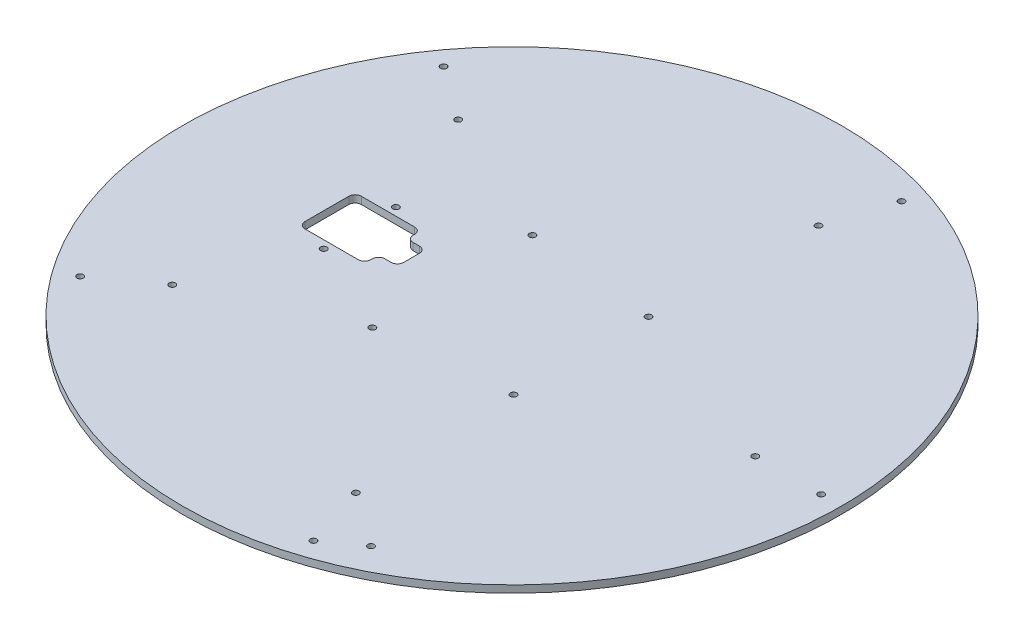
ISO-10303-21;
HEADER;
FILE_DESCRIPTION(('STEP AP214'),'2;1');
FILE_NAME('part.step','',(''),(''),'','','');
FILE_SCHEMA(('AUTOMOTIVE_DESIGN { 1 0 10303 214 1 1 1 1 }'));
ENDSEC;
DATA;
#1=APPLICATION_CONTEXT('core data for automotive mechanical design processes');
#2=APPLICATION_PROTOCOL_DEFINITION('international standard','automotive_design',2000,#1);
#3=PRODUCT_CONTEXT('',#1,'mechanical');
#4=PRODUCT('Part','Part','',(#3));
#5=PRODUCT_RELATED_PRODUCT_CATEGORY('part','',(#4));
#6=PRODUCT_DEFINITION_FORMATION('','',#4);
#7=PRODUCT_DEFINITION_CONTEXT('part definition',#1,'design');
#8=PRODUCT_DEFINITION('design','',#6,#7);
#9=PRODUCT_DEFINITION_SHAPE('','',#8);
#10=(LENGTH_UNIT() NAMED_UNIT(*) SI_UNIT(.MILLI.,.METRE.));
#11=(NAMED_UNIT(*) PLANE_ANGLE_UNIT() SI_UNIT($,.RADIAN.));
#12=(NAMED_UNIT(*) SI_UNIT($,.STERADIAN.) SOLID_ANGLE_UNIT());
#13=UNCERTAINTY_MEASURE_WITH_UNIT(LENGTH_MEASURE(1.E-05),#10,'distance_accuracy_value','');
#14=(GEOMETRIC_REPRESENTATION_CONTEXT(3) GLOBAL_UNCERTAINTY_ASSIGNED_CONTEXT((#13)) GLOBAL_UNIT_ASSIGNED_CONTEXT((#10,
#11,#12)) REPRESENTATION_CONTEXT('',''));
#15=CARTESIAN_POINT('',(0.,0.,0.));
#16=DIRECTION('',(0.,0.,1.));
#17=DIRECTION('',(1.,0.,0.));
#18=AXIS2_PLACEMENT_3D('',#15,#16,#17);
#19=CARTESIAN_POINT('',(0.,5.842,0.));
#20=DIRECTION('',(0.,-1.,0.));
#21=DIRECTION('',(0.,0.,-1.));
#22=AXIS2_PLACEMENT_3D('',#19,#20,#21);
#23=CYLINDRICAL_SURFACE('',#22,266.7);
#24=CARTESIAN_POINT('',(0.,5.842,0.));
#25=DIRECTION('',(0.,1.,0.));
#26=DIRECTION('',(0.,0.,1.));
#27=AXIS2_PLACEMENT_3D('',#24,#25,#26);
#28=CIRCLE('',#27,266.7);
#29=CARTESIAN_POINT('',(0.,5.842,266.7));
#30=VERTEX_POINT('',#29);
#31=EDGE_CURVE('E229',#30,#30,#28,.T.);
#32=ORIENTED_EDGE('',*,*,#31,.F.);
#33=EDGE_LOOP('',(#32));
#34=FACE_BOUND('',#33,.T.);
#35=CARTESIAN_POINT('',(0.,0.,0.));
#36=DIRECTION('',(0.,1.,0.));
#37=DIRECTION('',(0.,0.,1.));
#38=AXIS2_PLACEMENT_3D('',#35,#36,#37);
#39=CIRCLE('',#38,266.7);
#40=CARTESIAN_POINT('',(0.,0.,266.7));
#41=VERTEX_POINT('',#40);
#42=EDGE_CURVE('E226',#41,#41,#39,.T.);
#43=ORIENTED_EDGE('',*,*,#42,.T.);
#44=EDGE_LOOP('',(#43));
#45=FACE_BOUND('',#44,.T.);
#46=ADVANCED_FACE('F32',(#34,#45),#23,.T.);
#47=CARTESIAN_POINT('',(0.,5.842,0.));
#48=DIRECTION('',(0.,1.,0.));
#49=DIRECTION('',(0.,0.,1.));
#50=AXIS2_PLACEMENT_3D('',#47,#48,#49);
#51=PLANE('',#50);
#52=CARTESIAN_POINT('',(104.369393552189,5.842,218.470806034921));
#53=DIRECTION('',(0.,-1.,0.));
#54=DIRECTION('',(0.,0.,-1.));
#55=AXIS2_PLACEMENT_3D('',#52,#53,#54);
#56=CIRCLE('',#55,2.55270000000003);
#57=CARTESIAN_POINT('',(104.369393552189,5.842,215.918106034921));
#58=VERTEX_POINT('',#57);
#59=EDGE_CURVE('E391',#58,#58,#56,.T.);
#60=ORIENTED_EDGE('',*,*,#59,.T.);
#61=EDGE_LOOP('',(#60));
#62=FACE_BOUND('',#61,.T.);
#63=CARTESIAN_POINT('',(77.3129618226674,5.842,237.944829811885));
#64=DIRECTION('',(0.,1.,0.));
#65=DIRECTION('',(-0.951056516295155,0.,0.309016994374945));
#66=AXIS2_PLACEMENT_3D('',#63,#64,#65);
#67=CIRCLE('',#66,2.5527000000001);
#68=CARTESIAN_POINT('',(74.8851998535207,5.842,238.733657493426));
#69=VERTEX_POINT('',#68);
#70=EDGE_CURVE('E375',#69,#69,#67,.T.);
#71=ORIENTED_EDGE('',*,*,#70,.F.);
#72=EDGE_LOOP('',(#71));
#73=FACE_BOUND('',#72,.T.);
#74=CARTESIAN_POINT('',(-159.254995342707,5.842,-115.705526913775));
#75=DIRECTION('',(0.,1.,0.));
#76=DIRECTION('',(0.58778525229248,0.,-0.809016994374942));
#77=AXIS2_PLACEMENT_3D('',#74,#75,#76);
#78=CIRCLE('',#77,2.55269999999998);
#79=CARTESIAN_POINT('',(-157.75455592918,5.842,-117.770704595316));
#80=VERTEX_POINT('',#79);
#81=EDGE_CURVE('E383',#80,#80,#78,.T.);
#82=ORIENTED_EDGE('',*,*,#81,.F.);
#83=EDGE_LOOP('',(#82));
#84=FACE_BOUND('',#83,.T.);
#85=CARTESIAN_POINT('',(77.3129618226708,5.842,-237.944829811884));
#86=DIRECTION('',(0.,1.,0.));
#87=DIRECTION('',(0.95105651629515,0.,0.309016994374958));
#88=AXIS2_PLACEMENT_3D('',#85,#86,#87);
#89=CIRCLE('',#88,2.5527000000001);
#90=CARTESIAN_POINT('',(79.7407237918175,5.842,-237.156002130343));
#91=VERTEX_POINT('',#90);
#92=EDGE_CURVE('E376',#91,#91,#89,.T.);
#93=ORIENTED_EDGE('',*,*,#92,.F.);
#94=EDGE_LOOP('',(#93));
#95=FACE_BOUND('',#94,.T.);
#96=CARTESIAN_POINT('',(60.8299953427105,5.842,-187.2154752327));
#97=DIRECTION('',(0.,1.,0.));
#98=DIRECTION('',(0.95105651629515,0.,0.309016994374958));
#99=AXIS2_PLACEMENT_3D('',#96,#97,#98);
#100=CIRCLE('',#99,2.55269999999998);
#101=CARTESIAN_POINT('',(63.2577573118571,5.842,-186.426647551159));
#102=VERTEX_POINT('',#101);
#103=EDGE_CURVE('E388',#102,#102,#100,.T.);
#104=ORIENTED_EDGE('',*,*,#103,.F.);
#105=EDGE_LOOP('',(#104));
#106=FACE_BOUND('',#105,.T.);
#107=CARTESIAN_POINT('',(-202.407961822667,5.842,-147.057992271056));
#108=DIRECTION('',(0.,1.,0.));
#109=DIRECTION('',(0.58778525229248,0.,-0.809016994374942));
#110=AXIS2_PLACEMENT_3D('',#107,#108,#109);
#111=CIRCLE('',#110,2.5527000000001);
#112=CARTESIAN_POINT('',(-200.90752240914,5.842,-149.123169952597));
#113=VERTEX_POINT('',#112);
#114=EDGE_CURVE('E350',#113,#113,#111,.T.);
#115=ORIENTED_EDGE('',*,*,#114,.F.);
#116=EDGE_LOOP('',(#115));
#117=FACE_BOUND('',#116,.T.);
#118=CARTESIAN_POINT('',(-159.254995342709,5.842,115.705526913772));
#119=DIRECTION('',(0.,1.,0.));
#120=DIRECTION('',(-0.587785252292469,0.,-0.809016994374951));
#121=AXIS2_PLACEMENT_3D('',#118,#119,#120);
#122=CIRCLE('',#121,2.55269999999998);
#123=CARTESIAN_POINT('',(-160.755434756236,5.842,113.640349232232));
#124=VERTEX_POINT('',#123);
#125=EDGE_CURVE('E357',#124,#124,#122,.T.);
#126=ORIENTED_EDGE('',*,*,#125,.F.);
#127=EDGE_LOOP('',(#126));
#128=FACE_BOUND('',#127,.T.);
#129=CARTESIAN_POINT('',(-202.407961822669,5.842,147.057992271053));
#130=DIRECTION('',(0.,1.,0.));
#131=DIRECTION('',(-0.587785252292469,0.,-0.809016994374951));
#132=AXIS2_PLACEMENT_3D('',#129,#130,#131);
#133=CIRCLE('',#132,2.5527000000001);
#134=CARTESIAN_POINT('',(-203.908401236196,5.842,144.992814589512));
#135=VERTEX_POINT('',#134);
#136=EDGE_CURVE('E363',#135,#135,#133,.T.);
#137=ORIENTED_EDGE('',*,*,#136,.F.);
#138=EDGE_LOOP('',(#137));
#139=FACE_BOUND('',#138,.T.);
#140=CARTESIAN_POINT('',(60.8299953427079,5.842,187.215475232701));
#141=DIRECTION('',(0.,1.,0.));
#142=DIRECTION('',(-0.951056516295155,0.,0.309016994374945));
#143=AXIS2_PLACEMENT_3D('',#140,#141,#142);
#144=CIRCLE('',#143,2.55269999999998);
#145=CARTESIAN_POINT('',(58.4022333735613,5.842,188.004302914242));
#146=VERTEX_POINT('',#145);
#147=EDGE_CURVE('E369',#146,#146,#144,.T.);
#148=ORIENTED_EDGE('',*,*,#147,.F.);
#149=EDGE_LOOP('',(#148));
#150=FACE_BOUND('',#149,.T.);
#151=CARTESIAN_POINT('',(250.19,5.842,0.));
#152=DIRECTION('',(0.,1.,0.));
#153=DIRECTION('',(0.,0.,1.));
#154=AXIS2_PLACEMENT_3D('',#151,#152,#153);
#155=CIRCLE('',#154,2.5527000000001);
#156=CARTESIAN_POINT('',(250.19,5.842,2.5527000000001));
#157=VERTEX_POINT('',#156);
#158=EDGE_CURVE('E345',#157,#157,#155,.T.);
#159=ORIENTED_EDGE('',*,*,#158,.F.);
#160=EDGE_LOOP('',(#159));
#161=FACE_BOUND('',#160,.T.);
#162=CARTESIAN_POINT('',(196.85,5.842,0.));
#163=DIRECTION('',(0.,1.,0.));
#164=DIRECTION('',(0.,0.,1.));
#165=AXIS2_PLACEMENT_3D('',#162,#163,#164);
#166=CIRCLE('',#165,2.55269999999998);
#167=CARTESIAN_POINT('',(196.85,5.842,2.55269999999998));
#168=VERTEX_POINT('',#167);
#169=EDGE_CURVE('E338',#168,#168,#166,.T.);
#170=ORIENTED_EDGE('',*,*,#169,.F.);
#171=EDGE_LOOP('',(#170));
#172=FACE_BOUND('',#171,.T.);
#173=DIRECTION('',(0.,0.,-1.));
#174=VECTOR('',#173,1.);
#175=CARTESIAN_POINT('',(-96.52,5.842,-11.43));
#176=LINE('',#175,#174);
#177=CARTESIAN_POINT('',(-96.52,5.842,-16.51));
#178=VERTEX_POINT('',#177);
#179=CARTESIAN_POINT('',(-96.52,5.842,-17.78));
#180=VERTEX_POINT('',#179);
#181=EDGE_CURVE('E179',#178,#180,#176,.T.);
#182=ORIENTED_EDGE('',*,*,#181,.F.);
#183=CARTESIAN_POINT('',(-91.44,5.842,-16.51));
#184=DIRECTION('',(0.,1.,0.));
#185=DIRECTION('',(0.,0.,1.));
#186=AXIS2_PLACEMENT_3D('',#183,#184,#185);
#187=CIRCLE('',#186,5.08);
#188=CARTESIAN_POINT('',(-91.44,5.842,-11.43));
#189=VERTEX_POINT('',#188);
#190=EDGE_CURVE('E250',#178,#189,#187,.T.);
#191=ORIENTED_EDGE('',*,*,#190,.T.);
#192=DIRECTION('',(-1.,0.,0.));
#193=VECTOR('',#192,1.);
#194=CARTESIAN_POINT('',(-81.28,5.842,-11.43));
#195=LINE('',#194,#193);
#196=CARTESIAN_POINT('',(-86.36,5.842,-11.43));
#197=VERTEX_POINT('',#196);
#198=EDGE_CURVE('E308',#197,#189,#195,.T.);
#199=ORIENTED_EDGE('',*,*,#198,.F.);
#200=CARTESIAN_POINT('',(-86.36,5.842,-6.35));
#201=DIRECTION('',(0.,1.,0.));
#202=DIRECTION('',(0.,0.,1.));
#203=AXIS2_PLACEMENT_3D('',#200,#201,#202);
#204=CIRCLE('',#203,5.08);
#205=CARTESIAN_POINT('',(-81.28,5.842,-6.35));
#206=VERTEX_POINT('',#205);
#207=EDGE_CURVE('E283',#197,#206,#204,.F.);
#208=ORIENTED_EDGE('',*,*,#207,.T.);
#209=DIRECTION('',(0.,0.,-1.));
#210=VECTOR('',#209,1.);
#211=CARTESIAN_POINT('',(-81.28,5.842,0.));
#212=LINE('',#211,#210);
#213=CARTESIAN_POINT('',(-81.28,5.842,6.34999999999999));
#214=VERTEX_POINT('',#213);
#215=EDGE_CURVE('E187',#214,#206,#212,.T.);
#216=ORIENTED_EDGE('',*,*,#215,.F.);
#217=CARTESIAN_POINT('',(-86.36,5.842,6.34999999999999));
#218=DIRECTION('',(0.,1.,0.));
#219=DIRECTION('',(0.,0.,1.));
#220=AXIS2_PLACEMENT_3D('',#217,#218,#219);
#221=CIRCLE('',#220,5.08);
#222=CARTESIAN_POINT('',(-86.36,5.842,11.43));
#223=VERTEX_POINT('',#222);
#224=EDGE_CURVE('E287',#214,#223,#221,.F.);
#225=ORIENTED_EDGE('',*,*,#224,.T.);
#226=DIRECTION('',(1.,0.,0.));
#227=VECTOR('',#226,1.);
#228=CARTESIAN_POINT('',(-81.28,5.842,11.43));
#229=LINE('',#228,#227);
#230=CARTESIAN_POINT('',(-91.44,5.842,11.43));
#231=VERTEX_POINT('',#230);
#232=EDGE_CURVE('E184',#231,#223,#229,.T.);
#233=ORIENTED_EDGE('',*,*,#232,.F.);
#234=CARTESIAN_POINT('',(-91.44,5.842,16.51));
#235=DIRECTION('',(0.,1.,0.));
#236=DIRECTION('',(0.,0.,1.));
#237=AXIS2_PLACEMENT_3D('',#234,#235,#236);
#238=CIRCLE('',#237,5.08);
#239=CARTESIAN_POINT('',(-96.52,5.842,16.51));
#240=VERTEX_POINT('',#239);
#241=EDGE_CURVE('E248',#231,#240,#238,.T.);
#242=ORIENTED_EDGE('',*,*,#241,.T.);
#243=DIRECTION('',(0.,0.,-1.));
#244=VECTOR('',#243,1.);
#245=CARTESIAN_POINT('',(-96.52,5.842,22.86));
#246=LINE('',#245,#244);
#247=CARTESIAN_POINT('',(-96.52,5.842,17.78));
#248=VERTEX_POINT('',#247);
#249=EDGE_CURVE('E177',#248,#240,#246,.T.);
#250=ORIENTED_EDGE('',*,*,#249,.F.);
#251=CARTESIAN_POINT('',(-101.6,5.842,17.78));
#252=DIRECTION('',(0.,1.,0.));
#253=DIRECTION('',(0.,0.,1.));
#254=AXIS2_PLACEMENT_3D('',#251,#252,#253);
#255=CIRCLE('',#254,5.08);
#256=CARTESIAN_POINT('',(-101.6,5.842,22.86));
#257=VERTEX_POINT('',#256);
#258=EDGE_CURVE('E40',#248,#257,#255,.F.);
#259=ORIENTED_EDGE('',*,*,#258,.T.);
#260=DIRECTION('',(1.,0.,0.));
#261=VECTOR('',#260,1.);
#262=CARTESIAN_POINT('',(-123.19,5.842,22.86));
#263=LINE('',#262,#261);
#264=CARTESIAN_POINT('',(-144.78,5.842,22.86));
#265=VERTEX_POINT('',#264);
#266=EDGE_CURVE('E173',#265,#257,#263,.T.);
#267=ORIENTED_EDGE('',*,*,#266,.F.);
#268=CARTESIAN_POINT('',(-144.78,5.842,17.78));
#269=DIRECTION('',(0.,1.,0.));
#270=DIRECTION('',(0.,0.,1.));
#271=AXIS2_PLACEMENT_3D('',#268,#269,#270);
#272=CIRCLE('',#271,5.08);
#273=CARTESIAN_POINT('',(-149.86,5.842,17.78));
#274=VERTEX_POINT('',#273);
#275=EDGE_CURVE('E172',#265,#274,#272,.F.);
#276=ORIENTED_EDGE('',*,*,#275,.T.);
#277=DIRECTION('',(0.,0.,1.));
#278=VECTOR('',#277,1.);
#279=CARTESIAN_POINT('',(-149.86,5.842,0.));
#280=LINE('',#279,#278);
#281=CARTESIAN_POINT('',(-149.86,5.842,-17.78));
#282=VERTEX_POINT('',#281);
#283=EDGE_CURVE('E161',#282,#274,#280,.T.);
#284=ORIENTED_EDGE('',*,*,#283,.F.);
#285=CARTESIAN_POINT('',(-144.78,5.842,-17.78));
#286=DIRECTION('',(0.,1.,0.));
#287=DIRECTION('',(0.,0.,1.));
#288=AXIS2_PLACEMENT_3D('',#285,#286,#287);
#289=CIRCLE('',#288,5.08);
#290=CARTESIAN_POINT('',(-144.78,5.842,-22.86));
#291=VERTEX_POINT('',#290);
#292=EDGE_CURVE('E145',#282,#291,#289,.F.);
#293=ORIENTED_EDGE('',*,*,#292,.T.);
#294=DIRECTION('',(-1.,0.,0.));
#295=VECTOR('',#294,1.);
#296=CARTESIAN_POINT('',(-123.19,5.842,-22.86));
#297=LINE('',#296,#295);
#298=CARTESIAN_POINT('',(-101.6,5.842,-22.86));
#299=VERTEX_POINT('',#298);
#300=EDGE_CURVE('E174',#299,#291,#297,.T.);
#301=ORIENTED_EDGE('',*,*,#300,.F.);
#302=CARTESIAN_POINT('',(-101.6,5.842,-17.78));
#303=DIRECTION('',(0.,1.,0.));
#304=DIRECTION('',(0.,0.,1.));
#305=AXIS2_PLACEMENT_3D('',#302,#303,#304);
#306=CIRCLE('',#305,5.08);
#307=EDGE_CURVE('E279',#299,#180,#306,.F.);
#308=ORIENTED_EDGE('',*,*,#307,.T.);
#309=EDGE_LOOP('',(#182,#191,#199,#208,#216,#225,#233,#242,#250,#259,#267,#276,#284,#293,#301,#308));
#310=FACE_BOUND('',#309,.T.);
#311=CARTESIAN_POINT('',(-123.19,5.842,-29.21));
#312=DIRECTION('',(0.,1.,0.));
#313=DIRECTION('',(0.,0.,1.));
#314=AXIS2_PLACEMENT_3D('',#311,#312,#313);
#315=CIRCLE('',#314,2.55270000000001);
#316=CARTESIAN_POINT('',(-123.19,5.842,-26.6573));
#317=VERTEX_POINT('',#316);
#318=EDGE_CURVE('E194',#317,#317,#315,.T.);
#319=ORIENTED_EDGE('',*,*,#318,.F.);
#320=EDGE_LOOP('',(#319));
#321=FACE_BOUND('',#320,.T.);
#322=CARTESIAN_POINT('',(55.88,5.842,54.61));
#323=DIRECTION('',(0.,1.,0.));
#324=DIRECTION('',(0.,0.,1.));
#325=AXIS2_PLACEMENT_3D('',#322,#323,#324);
#326=CIRCLE('',#325,2.5527);
#327=CARTESIAN_POINT('',(55.88,5.842,57.1627));
#328=VERTEX_POINT('',#327);
#329=EDGE_CURVE('E203',#328,#328,#326,.T.);
#330=ORIENTED_EDGE('',*,*,#329,.F.);
#331=EDGE_LOOP('',(#330));
#332=FACE_BOUND('',#331,.T.);
#333=CARTESIAN_POINT('',(-48.26,5.842,64.77));
#334=DIRECTION('',(0.,1.,0.));
#335=DIRECTION('',(0.,0.,1.));
#336=AXIS2_PLACEMENT_3D('',#333,#334,#335);
#337=CIRCLE('',#336,2.5527);
#338=CARTESIAN_POINT('',(-48.26,5.842,67.3227));
#339=VERTEX_POINT('',#338);
#340=EDGE_CURVE('E202',#339,#339,#337,.T.);
#341=ORIENTED_EDGE('',*,*,#340,.F.);
#342=EDGE_LOOP('',(#341));
#343=FACE_BOUND('',#342,.T.);
#344=CARTESIAN_POINT('',(-48.26,5.842,-64.77));
#345=DIRECTION('',(0.,1.,0.));
#346=DIRECTION('',(0.,0.,1.));
#347=AXIS2_PLACEMENT_3D('',#344,#345,#346);
#348=CIRCLE('',#347,2.5527);
#349=CARTESIAN_POINT('',(-48.26,5.842,-62.2173));
#350=VERTEX_POINT('',#349);
#351=EDGE_CURVE('E215',#350,#350,#348,.T.);
#352=ORIENTED_EDGE('',*,*,#351,.F.);
#353=EDGE_LOOP('',(#352));
#354=FACE_BOUND('',#353,.T.);
#355=CARTESIAN_POINT('',(-123.19,5.842,29.21));
#356=DIRECTION('',(0.,1.,0.));
#357=DIRECTION('',(0.,0.,1.));
#358=AXIS2_PLACEMENT_3D('',#355,#356,#357);
#359=CIRCLE('',#358,2.55270000000001);
#360=CARTESIAN_POINT('',(-123.19,5.842,31.7627));
#361=VERTEX_POINT('',#360);
#362=EDGE_CURVE('E195',#361,#361,#359,.T.);
#363=ORIENTED_EDGE('',*,*,#362,.F.);
#364=EDGE_LOOP('',(#363));
#365=FACE_BOUND('',#364,.T.);
#366=CARTESIAN_POINT('',(55.88,5.842,-54.61));
#367=DIRECTION('',(0.,1.,0.));
#368=DIRECTION('',(0.,0.,1.));
#369=AXIS2_PLACEMENT_3D('',#366,#367,#368);
#370=CIRCLE('',#369,2.5527);
#371=CARTESIAN_POINT('',(55.88,5.842,-52.0573));
#372=VERTEX_POINT('',#371);
#373=EDGE_CURVE('E214',#372,#372,#370,.T.);
#374=ORIENTED_EDGE('',*,*,#373,.F.);
#375=EDGE_LOOP('',(#374));
#376=FACE_BOUND('',#375,.T.);
#377=ORIENTED_EDGE('',*,*,#31,.T.);
#378=EDGE_LOOP('',(#377));
#379=FACE_BOUND('',#378,.T.);
#380=ADVANCED_FACE('F169',(#62,#73,#84,#95,#106,#117,#128,#139,#150,#161,#172,#310,#321,#332,
#343,#354,#365,#376,#379),#51,.T.);
#381=CARTESIAN_POINT('',(0.,0.,0.));
#382=DIRECTION('',(0.,1.,0.));
#383=DIRECTION('',(0.,0.,1.));
#384=AXIS2_PLACEMENT_3D('',#381,#382,#383);
#385=PLANE('',#384);
#386=CARTESIAN_POINT('',(104.369393552189,0.,218.470806034921));
#387=DIRECTION('',(0.,-1.,0.));
#388=DIRECTION('',(0.,0.,-1.));
#389=AXIS2_PLACEMENT_3D('',#386,#387,#388);
#390=CIRCLE('',#389,2.55270000000003);
#391=CARTESIAN_POINT('',(104.369393552189,0.,215.918106034921));
#392=VERTEX_POINT('',#391);
#393=EDGE_CURVE('E398',#392,#392,#390,.T.);
#394=ORIENTED_EDGE('',*,*,#393,.F.);
#395=EDGE_LOOP('',(#394));
#396=FACE_BOUND('',#395,.T.);
#397=CARTESIAN_POINT('',(77.3129618226674,0.,237.944829811885));
#398=DIRECTION('',(0.,1.,0.));
#399=DIRECTION('',(-0.951056516295155,0.,0.309016994374945));
#400=AXIS2_PLACEMENT_3D('',#397,#398,#399);
#401=CIRCLE('',#400,2.5527000000001);
#402=CARTESIAN_POINT('',(74.8851998535207,0.,238.733657493426));
#403=VERTEX_POINT('',#402);
#404=EDGE_CURVE('E342',#403,#403,#401,.T.);
#405=ORIENTED_EDGE('',*,*,#404,.T.);
#406=EDGE_LOOP('',(#405));
#407=FACE_BOUND('',#406,.T.);
#408=CARTESIAN_POINT('',(-159.254995342707,0.,-115.705526913775));
#409=DIRECTION('',(0.,1.,0.));
#410=DIRECTION('',(0.58778525229248,0.,-0.809016994374942));
#411=AXIS2_PLACEMENT_3D('',#408,#409,#410);
#412=CIRCLE('',#411,2.55269999999998);
#413=CARTESIAN_POINT('',(-157.75455592918,0.,-117.770704595316));
#414=VERTEX_POINT('',#413);
#415=EDGE_CURVE('E354',#414,#414,#412,.T.);
#416=ORIENTED_EDGE('',*,*,#415,.T.);
#417=EDGE_LOOP('',(#416));
#418=FACE_BOUND('',#417,.T.);
#419=CARTESIAN_POINT('',(77.3129618226708,0.,-237.944829811884));
#420=DIRECTION('',(0.,1.,0.));
#421=DIRECTION('',(0.95105651629515,0.,0.309016994374958));
#422=AXIS2_PLACEMENT_3D('',#419,#420,#421);
#423=CIRCLE('',#422,2.5527000000001);
#424=CARTESIAN_POINT('',(79.7407237918175,0.,-237.156002130343));
#425=VERTEX_POINT('',#424);
#426=EDGE_CURVE('E379',#425,#425,#423,.T.);
#427=ORIENTED_EDGE('',*,*,#426,.T.);
#428=EDGE_LOOP('',(#427));
#429=FACE_BOUND('',#428,.T.);
#430=CARTESIAN_POINT('',(60.8299953427105,0.,-187.2154752327));
#431=DIRECTION('',(0.,1.,0.));
#432=DIRECTION('',(0.95105651629515,0.,0.309016994374958));
#433=AXIS2_PLACEMENT_3D('',#430,#431,#432);
#434=CIRCLE('',#433,2.55269999999998);
#435=CARTESIAN_POINT('',(63.2577573118571,0.,-186.426647551159));
#436=VERTEX_POINT('',#435);
#437=EDGE_CURVE('E380',#436,#436,#434,.T.);
#438=ORIENTED_EDGE('',*,*,#437,.T.);
#439=EDGE_LOOP('',(#438));
#440=FACE_BOUND('',#439,.T.);
#441=CARTESIAN_POINT('',(-202.407961822667,0.,-147.057992271056));
#442=DIRECTION('',(0.,1.,0.));
#443=DIRECTION('',(0.58778525229248,0.,-0.809016994374942));
#444=AXIS2_PLACEMENT_3D('',#441,#442,#443);
#445=CIRCLE('',#444,2.5527000000001);
#446=CARTESIAN_POINT('',(-200.90752240914,0.,-149.123169952597));
#447=VERTEX_POINT('',#446);
#448=EDGE_CURVE('E353',#447,#447,#445,.T.);
#449=ORIENTED_EDGE('',*,*,#448,.T.);
#450=EDGE_LOOP('',(#449));
#451=FACE_BOUND('',#450,.T.);
#452=CARTESIAN_POINT('',(-159.254995342709,0.,115.705526913772));
#453=DIRECTION('',(0.,1.,0.));
#454=DIRECTION('',(-0.587785252292469,0.,-0.809016994374951));
#455=AXIS2_PLACEMENT_3D('',#452,#453,#454);
#456=CIRCLE('',#455,2.55269999999998);
#457=CARTESIAN_POINT('',(-160.755434756236,0.,113.640349232232));
#458=VERTEX_POINT('',#457);
#459=EDGE_CURVE('E360',#458,#458,#456,.T.);
#460=ORIENTED_EDGE('',*,*,#459,.T.);
#461=EDGE_LOOP('',(#460));
#462=FACE_BOUND('',#461,.T.);
#463=CARTESIAN_POINT('',(-202.407961822669,0.,147.057992271053));
#464=DIRECTION('',(0.,1.,0.));
#465=DIRECTION('',(-0.587785252292469,0.,-0.809016994374951));
#466=AXIS2_PLACEMENT_3D('',#463,#464,#465);
#467=CIRCLE('',#466,2.5527000000001);
#468=CARTESIAN_POINT('',(-203.908401236196,0.,144.992814589512));
#469=VERTEX_POINT('',#468);
#470=EDGE_CURVE('E366',#469,#469,#467,.T.);
#471=ORIENTED_EDGE('',*,*,#470,.T.);
#472=EDGE_LOOP('',(#471));
#473=FACE_BOUND('',#472,.T.);
#474=CARTESIAN_POINT('',(60.8299953427079,0.,187.215475232701));
#475=DIRECTION('',(0.,1.,0.));
#476=DIRECTION('',(-0.951056516295155,0.,0.309016994374945));
#477=AXIS2_PLACEMENT_3D('',#474,#475,#476);
#478=CIRCLE('',#477,2.55269999999998);
#479=CARTESIAN_POINT('',(58.4022333735613,0.,188.004302914242));
#480=VERTEX_POINT('',#479);
#481=EDGE_CURVE('E372',#480,#480,#478,.T.);
#482=ORIENTED_EDGE('',*,*,#481,.T.);
#483=EDGE_LOOP('',(#482));
#484=FACE_BOUND('',#483,.T.);
#485=CARTESIAN_POINT('',(250.19,0.,0.));
#486=DIRECTION('',(0.,1.,0.));
#487=DIRECTION('',(0.,0.,1.));
#488=AXIS2_PLACEMENT_3D('',#485,#486,#487);
#489=CIRCLE('',#488,2.5527000000001);
#490=CARTESIAN_POINT('',(250.19,0.,2.5527000000001));
#491=VERTEX_POINT('',#490);
#492=EDGE_CURVE('E310',#491,#491,#489,.T.);
#493=ORIENTED_EDGE('',*,*,#492,.T.);
#494=EDGE_LOOP('',(#493));
#495=FACE_BOUND('',#494,.T.);
#496=CARTESIAN_POINT('',(196.85,0.,0.));
#497=DIRECTION('',(0.,1.,0.));
#498=DIRECTION('',(0.,0.,1.));
#499=AXIS2_PLACEMENT_3D('',#496,#497,#498);
#500=CIRCLE('',#499,2.55269999999998);
#501=CARTESIAN_POINT('',(196.85,0.,2.55269999999998));
#502=VERTEX_POINT('',#501);
#503=EDGE_CURVE('E341',#502,#502,#500,.T.);
#504=ORIENTED_EDGE('',*,*,#503,.T.);
#505=EDGE_LOOP('',(#504));
#506=FACE_BOUND('',#505,.T.);
#507=DIRECTION('',(-1.,0.,0.));
#508=VECTOR('',#507,1.);
#509=CARTESIAN_POINT('',(-81.28,0.,-11.43));
#510=LINE('',#509,#508);
#511=CARTESIAN_POINT('',(-86.36,0.,-11.43));
#512=VERTEX_POINT('',#511);
#513=CARTESIAN_POINT('',(-91.44,0.,-11.43));
#514=VERTEX_POINT('',#513);
#515=EDGE_CURVE('E332',#512,#514,#510,.T.);
#516=ORIENTED_EDGE('',*,*,#515,.T.);
#517=CARTESIAN_POINT('',(-91.44,0.,-16.51));
#518=DIRECTION('',(0.,1.,0.));
#519=DIRECTION('',(0.,0.,1.));
#520=AXIS2_PLACEMENT_3D('',#517,#518,#519);
#521=CIRCLE('',#520,5.08);
#522=CARTESIAN_POINT('',(-96.52,0.,-16.51));
#523=VERTEX_POINT('',#522);
#524=EDGE_CURVE('E259',#514,#523,#521,.F.);
#525=ORIENTED_EDGE('',*,*,#524,.T.);
#526=DIRECTION('',(0.,0.,-1.));
#527=VECTOR('',#526,1.);
#528=CARTESIAN_POINT('',(-96.52,0.,-11.43));
#529=LINE('',#528,#527);
#530=CARTESIAN_POINT('',(-96.52,0.,-17.78));
#531=VERTEX_POINT('',#530);
#532=EDGE_CURVE('E328',#523,#531,#529,.T.);
#533=ORIENTED_EDGE('',*,*,#532,.T.);
#534=CARTESIAN_POINT('',(-101.6,0.,-17.78));
#535=DIRECTION('',(0.,1.,0.));
#536=DIRECTION('',(0.,0.,1.));
#537=AXIS2_PLACEMENT_3D('',#534,#535,#536);
#538=CIRCLE('',#537,5.08);
#539=CARTESIAN_POINT('',(-101.6,0.,-22.86));
#540=VERTEX_POINT('',#539);
#541=EDGE_CURVE('E281',#531,#540,#538,.T.);
#542=ORIENTED_EDGE('',*,*,#541,.T.);
#543=DIRECTION('',(-1.,0.,0.));
#544=VECTOR('',#543,1.);
#545=CARTESIAN_POINT('',(-96.52,0.,-22.86));
#546=LINE('',#545,#544);
#547=CARTESIAN_POINT('',(-144.78,0.,-22.86));
#548=VERTEX_POINT('',#547);
#549=EDGE_CURVE('E327',#540,#548,#546,.T.);
#550=ORIENTED_EDGE('',*,*,#549,.T.);
#551=CARTESIAN_POINT('',(-144.78,0.,-17.78));
#552=DIRECTION('',(0.,1.,0.));
#553=DIRECTION('',(0.,0.,1.));
#554=AXIS2_PLACEMENT_3D('',#551,#552,#553);
#555=CIRCLE('',#554,5.08);
#556=CARTESIAN_POINT('',(-149.86,0.,-17.78));
#557=VERTEX_POINT('',#556);
#558=EDGE_CURVE('E155',#548,#557,#555,.T.);
#559=ORIENTED_EDGE('',*,*,#558,.T.);
#560=DIRECTION('',(0.,0.,1.));
#561=VECTOR('',#560,1.);
#562=CARTESIAN_POINT('',(-149.86,0.,-22.86));
#563=LINE('',#562,#561);
#564=CARTESIAN_POINT('',(-149.86,0.,17.78));
#565=VERTEX_POINT('',#564);
#566=EDGE_CURVE('E164',#557,#565,#563,.T.);
#567=ORIENTED_EDGE('',*,*,#566,.T.);
#568=CARTESIAN_POINT('',(-144.78,0.,17.78));
#569=DIRECTION('',(0.,1.,0.));
#570=DIRECTION('',(0.,0.,1.));
#571=AXIS2_PLACEMENT_3D('',#568,#569,#570);
#572=CIRCLE('',#571,5.08);
#573=CARTESIAN_POINT('',(-144.78,0.,22.86));
#574=VERTEX_POINT('',#573);
#575=EDGE_CURVE('E277',#565,#574,#572,.T.);
#576=ORIENTED_EDGE('',*,*,#575,.T.);
#577=DIRECTION('',(1.,0.,0.));
#578=VECTOR('',#577,1.);
#579=CARTESIAN_POINT('',(-149.86,0.,22.86));
#580=LINE('',#579,#578);
#581=CARTESIAN_POINT('',(-101.6,0.,22.86));
#582=VERTEX_POINT('',#581);
#583=EDGE_CURVE('E301',#574,#582,#580,.T.);
#584=ORIENTED_EDGE('',*,*,#583,.T.);
#585=CARTESIAN_POINT('',(-101.6,0.,17.78));
#586=DIRECTION('',(0.,1.,0.));
#587=DIRECTION('',(0.,0.,1.));
#588=AXIS2_PLACEMENT_3D('',#585,#586,#587);
#589=CIRCLE('',#588,5.08);
#590=CARTESIAN_POINT('',(-96.52,0.,17.78));
#591=VERTEX_POINT('',#590);
#592=EDGE_CURVE('E11',#582,#591,#589,.T.);
#593=ORIENTED_EDGE('',*,*,#592,.T.);
#594=DIRECTION('',(0.,0.,-1.));
#595=VECTOR('',#594,1.);
#596=CARTESIAN_POINT('',(-96.52,0.,22.86));
#597=LINE('',#596,#595);
#598=CARTESIAN_POINT('',(-96.52,0.,16.51));
#599=VERTEX_POINT('',#598);
#600=EDGE_CURVE('E299',#591,#599,#597,.T.);
#601=ORIENTED_EDGE('',*,*,#600,.T.);
#602=CARTESIAN_POINT('',(-91.44,0.,16.51));
#603=DIRECTION('',(0.,1.,0.));
#604=DIRECTION('',(0.,0.,1.));
#605=AXIS2_PLACEMENT_3D('',#602,#603,#604);
#606=CIRCLE('',#605,5.08);
#607=CARTESIAN_POINT('',(-91.44,0.,11.43));
#608=VERTEX_POINT('',#607);
#609=EDGE_CURVE('E257',#599,#608,#606,.F.);
#610=ORIENTED_EDGE('',*,*,#609,.T.);
#611=DIRECTION('',(1.,0.,0.));
#612=VECTOR('',#611,1.);
#613=CARTESIAN_POINT('',(-81.28,0.,11.43));
#614=LINE('',#613,#612);
#615=CARTESIAN_POINT('',(-86.36,0.,11.43));
#616=VERTEX_POINT('',#615);
#617=EDGE_CURVE('E198',#608,#616,#614,.T.);
#618=ORIENTED_EDGE('',*,*,#617,.T.);
#619=CARTESIAN_POINT('',(-86.36,0.,6.34999999999999));
#620=DIRECTION('',(0.,1.,0.));
#621=DIRECTION('',(0.,0.,1.));
#622=AXIS2_PLACEMENT_3D('',#619,#620,#621);
#623=CIRCLE('',#622,5.08);
#624=CARTESIAN_POINT('',(-81.28,0.,6.34999999999999));
#625=VERTEX_POINT('',#624);
#626=EDGE_CURVE('E289',#616,#625,#623,.T.);
#627=ORIENTED_EDGE('',*,*,#626,.T.);
#628=DIRECTION('',(0.,0.,-1.));
#629=VECTOR('',#628,1.);
#630=CARTESIAN_POINT('',(-81.28,0.,0.));
#631=LINE('',#630,#629);
#632=CARTESIAN_POINT('',(-81.28,0.,-6.35));
#633=VERTEX_POINT('',#632);
#634=EDGE_CURVE('E190',#625,#633,#631,.T.);
#635=ORIENTED_EDGE('',*,*,#634,.T.);
#636=CARTESIAN_POINT('',(-86.36,0.,-6.35));
#637=DIRECTION('',(0.,1.,0.));
#638=DIRECTION('',(0.,0.,1.));
#639=AXIS2_PLACEMENT_3D('',#636,#637,#638);
#640=CIRCLE('',#639,5.08);
#641=EDGE_CURVE('E285',#633,#512,#640,.T.);
#642=ORIENTED_EDGE('',*,*,#641,.T.);
#643=EDGE_LOOP('',(#516,#525,#533,#542,#550,#559,#567,#576,#584,#593,#601,#610,#618,#627,#635,#642));
#644=FACE_BOUND('',#643,.T.);
#645=CARTESIAN_POINT('',(-123.19,0.,-29.21));
#646=DIRECTION('',(0.,1.,0.));
#647=DIRECTION('',(0.,0.,1.));
#648=AXIS2_PLACEMENT_3D('',#645,#646,#647);
#649=CIRCLE('',#648,2.55270000000001);
#650=CARTESIAN_POINT('',(-123.19,0.,-26.6573));
#651=VERTEX_POINT('',#650);
#652=EDGE_CURVE('E206',#651,#651,#649,.T.);
#653=ORIENTED_EDGE('',*,*,#652,.T.);
#654=EDGE_LOOP('',(#653));
#655=FACE_BOUND('',#654,.T.);
#656=CARTESIAN_POINT('',(55.88,0.,54.61));
#657=DIRECTION('',(0.,1.,0.));
#658=DIRECTION('',(0.,0.,1.));
#659=AXIS2_PLACEMENT_3D('',#656,#657,#658);
#660=CIRCLE('',#659,2.5527);
#661=CARTESIAN_POINT('',(55.88,0.,57.1627));
#662=VERTEX_POINT('',#661);
#663=EDGE_CURVE('E199',#662,#662,#660,.T.);
#664=ORIENTED_EDGE('',*,*,#663,.T.);
#665=EDGE_LOOP('',(#664));
#666=FACE_BOUND('',#665,.T.);
#667=CARTESIAN_POINT('',(-48.26,0.,64.77));
#668=DIRECTION('',(0.,1.,0.));
#669=DIRECTION('',(0.,0.,1.));
#670=AXIS2_PLACEMENT_3D('',#667,#668,#669);
#671=CIRCLE('',#670,2.5527);
#672=CARTESIAN_POINT('',(-48.26,0.,67.3227));
#673=VERTEX_POINT('',#672);
#674=EDGE_CURVE('E218',#673,#673,#671,.T.);
#675=ORIENTED_EDGE('',*,*,#674,.T.);
#676=EDGE_LOOP('',(#675));
#677=FACE_BOUND('',#676,.T.);
#678=CARTESIAN_POINT('',(-48.26,0.,-64.77));
#679=DIRECTION('',(0.,1.,0.));
#680=DIRECTION('',(0.,0.,1.));
#681=AXIS2_PLACEMENT_3D('',#678,#679,#680);
#682=CIRCLE('',#681,2.5527);
#683=CARTESIAN_POINT('',(-48.26,0.,-62.2173));
#684=VERTEX_POINT('',#683);
#685=EDGE_CURVE('E211',#684,#684,#682,.T.);
#686=ORIENTED_EDGE('',*,*,#685,.T.);
#687=EDGE_LOOP('',(#686));
#688=FACE_BOUND('',#687,.T.);
#689=CARTESIAN_POINT('',(-123.19,0.,29.21));
#690=DIRECTION('',(0.,1.,0.));
#691=DIRECTION('',(0.,0.,1.));
#692=AXIS2_PLACEMENT_3D('',#689,#690,#691);
#693=CIRCLE('',#692,2.55270000000001);
#694=CARTESIAN_POINT('',(-123.19,0.,31.7627));
#695=VERTEX_POINT('',#694);
#696=EDGE_CURVE('E191',#695,#695,#693,.T.);
#697=ORIENTED_EDGE('',*,*,#696,.T.);
#698=EDGE_LOOP('',(#697));
#699=FACE_BOUND('',#698,.T.);
#700=CARTESIAN_POINT('',(55.88,0.,-54.61));
#701=DIRECTION('',(0.,1.,0.));
#702=DIRECTION('',(0.,0.,1.));
#703=AXIS2_PLACEMENT_3D('',#700,#701,#702);
#704=CIRCLE('',#703,2.5527);
#705=CARTESIAN_POINT('',(55.88,0.,-52.0573));
#706=VERTEX_POINT('',#705);
#707=EDGE_CURVE('E223',#706,#706,#704,.T.);
#708=ORIENTED_EDGE('',*,*,#707,.T.);
#709=EDGE_LOOP('',(#708));
#710=FACE_BOUND('',#709,.T.);
#711=ORIENTED_EDGE('',*,*,#42,.F.);
#712=EDGE_LOOP('',(#711));
#713=FACE_BOUND('',#712,.T.);
#714=ADVANCED_FACE('F325',(#396,#407,#418,#429,#440,#451,#462,#473,#484,#495,#506,#644,#655,
#666,#677,#688,#699,#710,#713),#385,.F.);
#715=CARTESIAN_POINT('',(55.88,0.,-54.61));
#716=DIRECTION('',(0.,1.,0.));
#717=DIRECTION('',(0.,0.,1.));
#718=AXIS2_PLACEMENT_3D('',#715,#716,#717);
#719=CYLINDRICAL_SURFACE('',#718,2.5527);
#720=ORIENTED_EDGE('',*,*,#707,.F.);
#721=EDGE_LOOP('',(#720));
#722=FACE_BOUND('',#721,.T.);
#723=ORIENTED_EDGE('',*,*,#373,.T.);
#724=EDGE_LOOP('',(#723));
#725=FACE_BOUND('',#724,.T.);
#726=ADVANCED_FACE('F415',(#722,#725),#719,.F.);
#727=CARTESIAN_POINT('',(-123.19,0.,29.21));
#728=DIRECTION('',(0.,1.,0.));
#729=DIRECTION('',(0.,0.,1.));
#730=AXIS2_PLACEMENT_3D('',#727,#728,#729);
#731=CYLINDRICAL_SURFACE('',#730,2.55270000000001);
#732=ORIENTED_EDGE('',*,*,#696,.F.);
#733=EDGE_LOOP('',(#732));
#734=FACE_BOUND('',#733,.T.);
#735=ORIENTED_EDGE('',*,*,#362,.T.);
#736=EDGE_LOOP('',(#735));
#737=FACE_BOUND('',#736,.T.);
#738=ADVANCED_FACE('F520',(#734,#737),#731,.F.);
#739=CARTESIAN_POINT('',(-48.26,0.,-64.77));
#740=DIRECTION('',(0.,1.,0.));
#741=DIRECTION('',(0.,0.,1.));
#742=AXIS2_PLACEMENT_3D('',#739,#740,#741);
#743=CYLINDRICAL_SURFACE('',#742,2.5527);
#744=ORIENTED_EDGE('',*,*,#685,.F.);
#745=EDGE_LOOP('',(#744));
#746=FACE_BOUND('',#745,.T.);
#747=ORIENTED_EDGE('',*,*,#351,.T.);
#748=EDGE_LOOP('',(#747));
#749=FACE_BOUND('',#748,.T.);
#750=ADVANCED_FACE('F523',(#746,#749),#743,.F.);
#751=CARTESIAN_POINT('',(-48.26,0.,64.77));
#752=DIRECTION('',(0.,1.,0.));
#753=DIRECTION('',(0.,0.,1.));
#754=AXIS2_PLACEMENT_3D('',#751,#752,#753);
#755=CYLINDRICAL_SURFACE('',#754,2.5527);
#756=ORIENTED_EDGE('',*,*,#674,.F.);
#757=EDGE_LOOP('',(#756));
#758=FACE_BOUND('',#757,.T.);
#759=ORIENTED_EDGE('',*,*,#340,.T.);
#760=EDGE_LOOP('',(#759));
#761=FACE_BOUND('',#760,.T.);
#762=ADVANCED_FACE('F528',(#758,#761),#755,.F.);
#763=CARTESIAN_POINT('',(55.88,0.,54.61));
#764=DIRECTION('',(0.,1.,0.));
#765=DIRECTION('',(0.,0.,1.));
#766=AXIS2_PLACEMENT_3D('',#763,#764,#765);
#767=CYLINDRICAL_SURFACE('',#766,2.5527);
#768=ORIENTED_EDGE('',*,*,#663,.F.);
#769=EDGE_LOOP('',(#768));
#770=FACE_BOUND('',#769,.T.);
#771=ORIENTED_EDGE('',*,*,#329,.T.);
#772=EDGE_LOOP('',(#771));
#773=FACE_BOUND('',#772,.T.);
#774=ADVANCED_FACE('F525',(#770,#773),#767,.F.);
#775=CARTESIAN_POINT('',(-123.19,0.,-29.21));
#776=DIRECTION('',(0.,1.,0.));
#777=DIRECTION('',(0.,0.,1.));
#778=AXIS2_PLACEMENT_3D('',#775,#776,#777);
#779=CYLINDRICAL_SURFACE('',#778,2.55270000000001);
#780=ORIENTED_EDGE('',*,*,#652,.F.);
#781=EDGE_LOOP('',(#780));
#782=FACE_BOUND('',#781,.T.);
#783=ORIENTED_EDGE('',*,*,#318,.T.);
#784=EDGE_LOOP('',(#783));
#785=FACE_BOUND('',#784,.T.);
#786=ADVANCED_FACE('F507',(#782,#785),#779,.F.);
#787=CARTESIAN_POINT('',(-81.28,0.,0.));
#788=DIRECTION('',(1.,0.,0.));
#789=DIRECTION('',(0.,0.,-1.));
#790=AXIS2_PLACEMENT_3D('',#787,#788,#789);
#791=PLANE('',#790);
#792=ORIENTED_EDGE('',*,*,#215,.T.);
#793=DIRECTION('',(0.,1.,0.));
#794=VECTOR('',#793,1.);
#795=CARTESIAN_POINT('',(-81.28,0.,-6.35));
#796=LINE('',#795,#794);
#797=EDGE_CURVE('E264',#206,#633,#796,.F.);
#798=ORIENTED_EDGE('',*,*,#797,.T.);
#799=ORIENTED_EDGE('',*,*,#634,.F.);
#800=DIRECTION('',(0.,1.,0.));
#801=VECTOR('',#800,1.);
#802=CARTESIAN_POINT('',(-81.28,5.842,6.34999999999999));
#803=LINE('',#802,#801);
#804=EDGE_CURVE('E261',#625,#214,#803,.T.);
#805=ORIENTED_EDGE('',*,*,#804,.T.);
#806=EDGE_LOOP('',(#792,#798,#799,#805));
#807=FACE_BOUND('',#806,.T.);
#808=ADVANCED_FACE('F487',(#807),#791,.F.);
#809=CARTESIAN_POINT('',(-81.28,0.,11.43));
#810=DIRECTION('',(0.,0.,1.));
#811=DIRECTION('',(1.,0.,0.));
#812=AXIS2_PLACEMENT_3D('',#809,#810,#811);
#813=PLANE('',#812);
#814=ORIENTED_EDGE('',*,*,#617,.F.);
#815=DIRECTION('',(0.,1.,0.));
#816=VECTOR('',#815,1.);
#817=CARTESIAN_POINT('',(-91.44,0.,11.43));
#818=LINE('',#817,#816);
#819=EDGE_CURVE('E268',#608,#231,#818,.T.);
#820=ORIENTED_EDGE('',*,*,#819,.T.);
#821=ORIENTED_EDGE('',*,*,#232,.T.);
#822=DIRECTION('',(0.,1.,0.));
#823=VECTOR('',#822,1.);
#824=CARTESIAN_POINT('',(-86.36,0.,11.43));
#825=LINE('',#824,#823);
#826=EDGE_CURVE('E266',#223,#616,#825,.F.);
#827=ORIENTED_EDGE('',*,*,#826,.T.);
#828=EDGE_LOOP('',(#814,#820,#821,#827));
#829=FACE_BOUND('',#828,.T.);
#830=ADVANCED_FACE('F498',(#829),#813,.F.);
#831=CARTESIAN_POINT('',(-96.52,0.,22.86));
#832=DIRECTION('',(1.,0.,0.));
#833=DIRECTION('',(0.,0.,-1.));
#834=AXIS2_PLACEMENT_3D('',#831,#832,#833);
#835=PLANE('',#834);
#836=ORIENTED_EDGE('',*,*,#249,.T.);
#837=DIRECTION('',(0.,1.,0.));
#838=VECTOR('',#837,1.);
#839=CARTESIAN_POINT('',(-96.52,0.,16.51));
#840=LINE('',#839,#838);
#841=EDGE_CURVE('E47',#240,#599,#840,.F.);
#842=ORIENTED_EDGE('',*,*,#841,.T.);
#843=ORIENTED_EDGE('',*,*,#600,.F.);
#844=DIRECTION('',(0.,1.,0.));
#845=VECTOR('',#844,1.);
#846=CARTESIAN_POINT('',(-96.52,5.842,17.78));
#847=LINE('',#846,#845);
#848=EDGE_CURVE('E271',#591,#248,#847,.T.);
#849=ORIENTED_EDGE('',*,*,#848,.T.);
#850=EDGE_LOOP('',(#836,#842,#843,#849));
#851=FACE_BOUND('',#850,.T.);
#852=ADVANCED_FACE('F298',(#851),#835,.F.);
#853=CARTESIAN_POINT('',(-123.19,0.,22.86));
#854=DIRECTION('',(0.,0.,1.));
#855=DIRECTION('',(1.,0.,0.));
#856=AXIS2_PLACEMENT_3D('',#853,#854,#855);
#857=PLANE('',#856);
#858=ORIENTED_EDGE('',*,*,#583,.F.);
#859=DIRECTION('',(0.,1.,0.));
#860=VECTOR('',#859,1.);
#861=CARTESIAN_POINT('',(-144.78,5.842,22.86));
#862=LINE('',#861,#860);
#863=EDGE_CURVE('E240',#574,#265,#862,.T.);
#864=ORIENTED_EDGE('',*,*,#863,.T.);
#865=ORIENTED_EDGE('',*,*,#266,.T.);
#866=DIRECTION('',(0.,1.,0.));
#867=VECTOR('',#866,1.);
#868=CARTESIAN_POINT('',(-101.6,0.,22.86));
#869=LINE('',#868,#867);
#870=EDGE_CURVE('E238',#257,#582,#869,.F.);
#871=ORIENTED_EDGE('',*,*,#870,.T.);
#872=EDGE_LOOP('',(#858,#864,#865,#871));
#873=FACE_BOUND('',#872,.T.);
#874=ADVANCED_FACE('F296',(#873),#857,.F.);
#875=CARTESIAN_POINT('',(-149.86,0.,0.));
#876=DIRECTION('',(-1.,0.,0.));
#877=DIRECTION('',(0.,0.,1.));
#878=AXIS2_PLACEMENT_3D('',#875,#876,#877);
#879=PLANE('',#878);
#880=ORIENTED_EDGE('',*,*,#566,.F.);
#881=DIRECTION('',(0.,1.,0.));
#882=VECTOR('',#881,1.);
#883=CARTESIAN_POINT('',(-149.86,5.842,-17.78));
#884=LINE('',#883,#882);
#885=EDGE_CURVE('E149',#557,#282,#884,.T.);
#886=ORIENTED_EDGE('',*,*,#885,.T.);
#887=ORIENTED_EDGE('',*,*,#283,.T.);
#888=DIRECTION('',(0.,1.,0.));
#889=VECTOR('',#888,1.);
#890=CARTESIAN_POINT('',(-149.86,0.,17.78));
#891=LINE('',#890,#889);
#892=EDGE_CURVE('E166',#274,#565,#891,.F.);
#893=ORIENTED_EDGE('',*,*,#892,.T.);
#894=EDGE_LOOP('',(#880,#886,#887,#893));
#895=FACE_BOUND('',#894,.T.);
#896=ADVANCED_FACE('F160',(#895),#879,.F.);
#897=CARTESIAN_POINT('',(-123.19,0.,-22.86));
#898=DIRECTION('',(0.,0.,-1.));
#899=DIRECTION('',(-1.,0.,0.));
#900=AXIS2_PLACEMENT_3D('',#897,#898,#899);
#901=PLANE('',#900);
#902=ORIENTED_EDGE('',*,*,#300,.T.);
#903=DIRECTION('',(0.,1.,0.));
#904=VECTOR('',#903,1.);
#905=CARTESIAN_POINT('',(-144.78,0.,-22.86));
#906=LINE('',#905,#904);
#907=EDGE_CURVE('E150',#291,#548,#906,.F.);
#908=ORIENTED_EDGE('',*,*,#907,.T.);
#909=ORIENTED_EDGE('',*,*,#549,.F.);
#910=DIRECTION('',(0.,1.,0.));
#911=VECTOR('',#910,1.);
#912=CARTESIAN_POINT('',(-101.6,5.842,-22.86));
#913=LINE('',#912,#911);
#914=EDGE_CURVE('E165',#540,#299,#913,.T.);
#915=ORIENTED_EDGE('',*,*,#914,.T.);
#916=EDGE_LOOP('',(#902,#908,#909,#915));
#917=FACE_BOUND('',#916,.T.);
#918=ADVANCED_FACE('F330',(#917),#901,.F.);
#919=CARTESIAN_POINT('',(-96.52,0.,-11.43));
#920=DIRECTION('',(1.,0.,0.));
#921=DIRECTION('',(0.,0.,-1.));
#922=AXIS2_PLACEMENT_3D('',#919,#920,#921);
#923=PLANE('',#922);
#924=ORIENTED_EDGE('',*,*,#181,.T.);
#925=DIRECTION('',(0.,1.,0.));
#926=VECTOR('',#925,1.);
#927=CARTESIAN_POINT('',(-96.52,0.,-17.78));
#928=LINE('',#927,#926);
#929=EDGE_CURVE('E246',#180,#531,#928,.F.);
#930=ORIENTED_EDGE('',*,*,#929,.T.);
#931=ORIENTED_EDGE('',*,*,#532,.F.);
#932=DIRECTION('',(0.,1.,0.));
#933=VECTOR('',#932,1.);
#934=CARTESIAN_POINT('',(-96.52,0.,-16.51));
#935=LINE('',#934,#933);
#936=EDGE_CURVE('E243',#523,#178,#935,.T.);
#937=ORIENTED_EDGE('',*,*,#936,.T.);
#938=EDGE_LOOP('',(#924,#930,#931,#937));
#939=FACE_BOUND('',#938,.T.);
#940=ADVANCED_FACE('F314',(#939),#923,.F.);
#941=CARTESIAN_POINT('',(-81.28,0.,-11.43));
#942=DIRECTION('',(0.,0.,-1.));
#943=DIRECTION('',(-1.,0.,0.));
#944=AXIS2_PLACEMENT_3D('',#941,#942,#943);
#945=PLANE('',#944);
#946=ORIENTED_EDGE('',*,*,#198,.T.);
#947=DIRECTION('',(0.,1.,0.));
#948=VECTOR('',#947,1.);
#949=CARTESIAN_POINT('',(-91.44,0.,-11.43));
#950=LINE('',#949,#948);
#951=EDGE_CURVE('E255',#189,#514,#950,.F.);
#952=ORIENTED_EDGE('',*,*,#951,.T.);
#953=ORIENTED_EDGE('',*,*,#515,.F.);
#954=DIRECTION('',(0.,1.,0.));
#955=VECTOR('',#954,1.);
#956=CARTESIAN_POINT('',(-86.36,5.842,-11.43));
#957=LINE('',#956,#955);
#958=EDGE_CURVE('E252',#512,#197,#957,.T.);
#959=ORIENTED_EDGE('',*,*,#958,.T.);
#960=EDGE_LOOP('',(#946,#952,#953,#959));
#961=FACE_BOUND('',#960,.T.);
#962=ADVANCED_FACE('F457',(#961),#945,.F.);
#963=CARTESIAN_POINT('',(-144.78,0.,-17.78));
#964=DIRECTION('',(0.,-1.,0.));
#965=DIRECTION('',(0.,0.,-1.));
#966=AXIS2_PLACEMENT_3D('',#963,#964,#965);
#967=CYLINDRICAL_SURFACE('',#966,5.08);
#968=ORIENTED_EDGE('',*,*,#558,.F.);
#969=ORIENTED_EDGE('',*,*,#907,.F.);
#970=ORIENTED_EDGE('',*,*,#292,.F.);
#971=ORIENTED_EDGE('',*,*,#885,.F.);
#972=EDGE_LOOP('',(#968,#969,#970,#971));
#973=FACE_BOUND('',#972,.T.);
#974=ADVANCED_FACE('F148',(#973),#967,.F.);
#975=CARTESIAN_POINT('',(-144.78,0.,17.78));
#976=DIRECTION('',(0.,-1.,0.));
#977=DIRECTION('',(0.,0.,-1.));
#978=AXIS2_PLACEMENT_3D('',#975,#976,#977);
#979=CYLINDRICAL_SURFACE('',#978,5.08);
#980=ORIENTED_EDGE('',*,*,#575,.F.);
#981=ORIENTED_EDGE('',*,*,#892,.F.);
#982=ORIENTED_EDGE('',*,*,#275,.F.);
#983=ORIENTED_EDGE('',*,*,#863,.F.);
#984=EDGE_LOOP('',(#980,#981,#982,#983));
#985=FACE_BOUND('',#984,.T.);
#986=ADVANCED_FACE('F456',(#985),#979,.F.);
#987=CARTESIAN_POINT('',(-101.6,0.,-17.78));
#988=DIRECTION('',(0.,-1.,0.));
#989=DIRECTION('',(0.,0.,-1.));
#990=AXIS2_PLACEMENT_3D('',#987,#988,#989);
#991=CYLINDRICAL_SURFACE('',#990,5.08);
#992=ORIENTED_EDGE('',*,*,#541,.F.);
#993=ORIENTED_EDGE('',*,*,#929,.F.);
#994=ORIENTED_EDGE('',*,*,#307,.F.);
#995=ORIENTED_EDGE('',*,*,#914,.F.);
#996=EDGE_LOOP('',(#992,#993,#994,#995));
#997=FACE_BOUND('',#996,.T.);
#998=ADVANCED_FACE('F320',(#997),#991,.F.);
#999=CARTESIAN_POINT('',(-91.44,0.,-16.51));
#1000=DIRECTION('',(0.,1.,0.));
#1001=DIRECTION('',(0.,0.,1.));
#1002=AXIS2_PLACEMENT_3D('',#999,#1000,#1001);
#1003=CYLINDRICAL_SURFACE('',#1002,5.08);
#1004=ORIENTED_EDGE('',*,*,#524,.F.);
#1005=ORIENTED_EDGE('',*,*,#951,.F.);
#1006=ORIENTED_EDGE('',*,*,#190,.F.);
#1007=ORIENTED_EDGE('',*,*,#936,.F.);
#1008=EDGE_LOOP('',(#1004,#1005,#1006,#1007));
#1009=FACE_BOUND('',#1008,.T.);
#1010=ADVANCED_FACE('F463',(#1009),#1003,.T.);
#1011=CARTESIAN_POINT('',(-86.36,0.,-6.35));
#1012=DIRECTION('',(0.,-1.,0.));
#1013=DIRECTION('',(0.,0.,-1.));
#1014=AXIS2_PLACEMENT_3D('',#1011,#1012,#1013);
#1015=CYLINDRICAL_SURFACE('',#1014,5.08);
#1016=ORIENTED_EDGE('',*,*,#641,.F.);
#1017=ORIENTED_EDGE('',*,*,#797,.F.);
#1018=ORIENTED_EDGE('',*,*,#207,.F.);
#1019=ORIENTED_EDGE('',*,*,#958,.F.);
#1020=EDGE_LOOP('',(#1016,#1017,#1018,#1019));
#1021=FACE_BOUND('',#1020,.T.);
#1022=ADVANCED_FACE('F466',(#1021),#1015,.F.);
#1023=CARTESIAN_POINT('',(-91.44,0.,16.51));
#1024=DIRECTION('',(0.,1.,0.));
#1025=DIRECTION('',(0.,0.,1.));
#1026=AXIS2_PLACEMENT_3D('',#1023,#1024,#1025);
#1027=CYLINDRICAL_SURFACE('',#1026,5.08);
#1028=ORIENTED_EDGE('',*,*,#609,.F.);
#1029=ORIENTED_EDGE('',*,*,#841,.F.);
#1030=ORIENTED_EDGE('',*,*,#241,.F.);
#1031=ORIENTED_EDGE('',*,*,#819,.F.);
#1032=EDGE_LOOP('',(#1028,#1029,#1030,#1031));
#1033=FACE_BOUND('',#1032,.T.);
#1034=ADVANCED_FACE('F470',(#1033),#1027,.T.);
#1035=CARTESIAN_POINT('',(-86.36,0.,6.34999999999999));
#1036=DIRECTION('',(0.,-1.,0.));
#1037=DIRECTION('',(0.,0.,-1.));
#1038=AXIS2_PLACEMENT_3D('',#1035,#1036,#1037);
#1039=CYLINDRICAL_SURFACE('',#1038,5.08);
#1040=ORIENTED_EDGE('',*,*,#626,.F.);
#1041=ORIENTED_EDGE('',*,*,#826,.F.);
#1042=ORIENTED_EDGE('',*,*,#224,.F.);
#1043=ORIENTED_EDGE('',*,*,#804,.F.);
#1044=EDGE_LOOP('',(#1040,#1041,#1042,#1043));
#1045=FACE_BOUND('',#1044,.T.);
#1046=ADVANCED_FACE('F473',(#1045),#1039,.F.);
#1047=CARTESIAN_POINT('',(-101.6,0.,17.78));
#1048=DIRECTION('',(0.,-1.,0.));
#1049=DIRECTION('',(0.,0.,-1.));
#1050=AXIS2_PLACEMENT_3D('',#1047,#1048,#1049);
#1051=CYLINDRICAL_SURFACE('',#1050,5.08);
#1052=ORIENTED_EDGE('',*,*,#592,.F.);
#1053=ORIENTED_EDGE('',*,*,#870,.F.);
#1054=ORIENTED_EDGE('',*,*,#258,.F.);
#1055=ORIENTED_EDGE('',*,*,#848,.F.);
#1056=EDGE_LOOP('',(#1052,#1053,#1054,#1055));
#1057=FACE_BOUND('',#1056,.T.);
#1058=ADVANCED_FACE('F34',(#1057),#1051,.F.);
#1059=CARTESIAN_POINT('',(196.85,0.,0.));
#1060=DIRECTION('',(0.,1.,0.));
#1061=DIRECTION('',(0.,0.,1.));
#1062=AXIS2_PLACEMENT_3D('',#1059,#1060,#1061);
#1063=CYLINDRICAL_SURFACE('',#1062,2.55269999999998);
#1064=ORIENTED_EDGE('',*,*,#503,.F.);
#1065=EDGE_LOOP('',(#1064));
#1066=FACE_BOUND('',#1065,.T.);
#1067=ORIENTED_EDGE('',*,*,#169,.T.);
#1068=EDGE_LOOP('',(#1067));
#1069=FACE_BOUND('',#1068,.T.);
#1070=ADVANCED_FACE('F437',(#1066,#1069),#1063,.F.);
#1071=CARTESIAN_POINT('',(250.19,0.,0.));
#1072=DIRECTION('',(0.,1.,0.));
#1073=DIRECTION('',(0.,0.,1.));
#1074=AXIS2_PLACEMENT_3D('',#1071,#1072,#1073);
#1075=CYLINDRICAL_SURFACE('',#1074,2.5527000000001);
#1076=ORIENTED_EDGE('',*,*,#492,.F.);
#1077=EDGE_LOOP('',(#1076));
#1078=FACE_BOUND('',#1077,.T.);
#1079=ORIENTED_EDGE('',*,*,#158,.T.);
#1080=EDGE_LOOP('',(#1079));
#1081=FACE_BOUND('',#1080,.T.);
#1082=ADVANCED_FACE('F440',(#1078,#1081),#1075,.F.);
#1083=CARTESIAN_POINT('',(60.8299953427079,0.,187.215475232701));
#1084=DIRECTION('',(0.,1.,0.));
#1085=DIRECTION('',(0.,0.,1.));
#1086=AXIS2_PLACEMENT_3D('',#1083,#1084,#1085);
#1087=CYLINDRICAL_SURFACE('',#1086,2.55269999999998);
#1088=ORIENTED_EDGE('',*,*,#481,.F.);
#1089=EDGE_LOOP('',(#1088));
#1090=FACE_BOUND('',#1089,.T.);
#1091=ORIENTED_EDGE('',*,*,#147,.T.);
#1092=EDGE_LOOP('',(#1091));
#1093=FACE_BOUND('',#1092,.T.);
#1094=ADVANCED_FACE('F699',(#1090,#1093),#1087,.F.);
#1095=CARTESIAN_POINT('',(-202.407961822669,0.,147.057992271053));
#1096=DIRECTION('',(0.,1.,0.));
#1097=DIRECTION('',(0.,0.,1.));
#1098=AXIS2_PLACEMENT_3D('',#1095,#1096,#1097);
#1099=CYLINDRICAL_SURFACE('',#1098,2.5527000000001);
#1100=ORIENTED_EDGE('',*,*,#470,.F.);
#1101=EDGE_LOOP('',(#1100));
#1102=FACE_BOUND('',#1101,.T.);
#1103=ORIENTED_EDGE('',*,*,#136,.T.);
#1104=EDGE_LOOP('',(#1103));
#1105=FACE_BOUND('',#1104,.T.);
#1106=ADVANCED_FACE('F709',(#1102,#1105),#1099,.F.);
#1107=CARTESIAN_POINT('',(-159.254995342709,0.,115.705526913772));
#1108=DIRECTION('',(0.,1.,0.));
#1109=DIRECTION('',(0.,0.,1.));
#1110=AXIS2_PLACEMENT_3D('',#1107,#1108,#1109);
#1111=CYLINDRICAL_SURFACE('',#1110,2.55269999999998);
#1112=ORIENTED_EDGE('',*,*,#459,.F.);
#1113=EDGE_LOOP('',(#1112));
#1114=FACE_BOUND('',#1113,.T.);
#1115=ORIENTED_EDGE('',*,*,#125,.T.);
#1116=EDGE_LOOP('',(#1115));
#1117=FACE_BOUND('',#1116,.T.);
#1118=ADVANCED_FACE('F719',(#1114,#1117),#1111,.F.);
#1119=CARTESIAN_POINT('',(-202.407961822667,0.,-147.057992271056));
#1120=DIRECTION('',(0.,1.,0.));
#1121=DIRECTION('',(0.,0.,1.));
#1122=AXIS2_PLACEMENT_3D('',#1119,#1120,#1121);
#1123=CYLINDRICAL_SURFACE('',#1122,2.5527000000001);
#1124=ORIENTED_EDGE('',*,*,#448,.F.);
#1125=EDGE_LOOP('',(#1124));
#1126=FACE_BOUND('',#1125,.T.);
#1127=ORIENTED_EDGE('',*,*,#114,.T.);
#1128=EDGE_LOOP('',(#1127));
#1129=FACE_BOUND('',#1128,.T.);
#1130=ADVANCED_FACE('F729',(#1126,#1129),#1123,.F.);
#1131=CARTESIAN_POINT('',(60.8299953427105,0.,-187.2154752327));
#1132=DIRECTION('',(0.,1.,0.));
#1133=DIRECTION('',(0.,0.,1.));
#1134=AXIS2_PLACEMENT_3D('',#1131,#1132,#1133);
#1135=CYLINDRICAL_SURFACE('',#1134,2.55269999999998);
#1136=ORIENTED_EDGE('',*,*,#437,.F.);
#1137=EDGE_LOOP('',(#1136));
#1138=FACE_BOUND('',#1137,.T.);
#1139=ORIENTED_EDGE('',*,*,#103,.T.);
#1140=EDGE_LOOP('',(#1139));
#1141=FACE_BOUND('',#1140,.T.);
#1142=ADVANCED_FACE('F739',(#1138,#1141),#1135,.F.);
#1143=CARTESIAN_POINT('',(77.3129618226708,0.,-237.944829811884));
#1144=DIRECTION('',(0.,1.,0.));
#1145=DIRECTION('',(0.,0.,1.));
#1146=AXIS2_PLACEMENT_3D('',#1143,#1144,#1145);
#1147=CYLINDRICAL_SURFACE('',#1146,2.5527000000001);
#1148=ORIENTED_EDGE('',*,*,#426,.F.);
#1149=EDGE_LOOP('',(#1148));
#1150=FACE_BOUND('',#1149,.T.);
#1151=ORIENTED_EDGE('',*,*,#92,.T.);
#1152=EDGE_LOOP('',(#1151));
#1153=FACE_BOUND('',#1152,.T.);
#1154=ADVANCED_FACE('F749',(#1150,#1153),#1147,.F.);
#1155=CARTESIAN_POINT('',(-159.254995342707,0.,-115.705526913775));
#1156=DIRECTION('',(0.,1.,0.));
#1157=DIRECTION('',(0.,0.,1.));
#1158=AXIS2_PLACEMENT_3D('',#1155,#1156,#1157);
#1159=CYLINDRICAL_SURFACE('',#1158,2.55269999999998);
#1160=ORIENTED_EDGE('',*,*,#415,.F.);
#1161=EDGE_LOOP('',(#1160));
#1162=FACE_BOUND('',#1161,.T.);
#1163=ORIENTED_EDGE('',*,*,#81,.T.);
#1164=EDGE_LOOP('',(#1163));
#1165=FACE_BOUND('',#1164,.T.);
#1166=ADVANCED_FACE('F759',(#1162,#1165),#1159,.F.);
#1167=CARTESIAN_POINT('',(77.3129618226674,0.,237.944829811885));
#1168=DIRECTION('',(0.,1.,0.));
#1169=DIRECTION('',(0.,0.,1.));
#1170=AXIS2_PLACEMENT_3D('',#1167,#1168,#1169);
#1171=CYLINDRICAL_SURFACE('',#1170,2.5527000000001);
#1172=ORIENTED_EDGE('',*,*,#404,.F.);
#1173=EDGE_LOOP('',(#1172));
#1174=FACE_BOUND('',#1173,.T.);
#1175=ORIENTED_EDGE('',*,*,#70,.T.);
#1176=EDGE_LOOP('',(#1175));
#1177=FACE_BOUND('',#1176,.T.);
#1178=ADVANCED_FACE('F409',(#1174,#1177),#1171,.F.);
#1179=CARTESIAN_POINT('',(104.369393552189,5.842,218.470806034921));
#1180=DIRECTION('',(0.,-1.,0.));
#1181=DIRECTION('',(0.,0.,-1.));
#1182=AXIS2_PLACEMENT_3D('',#1179,#1180,#1181);
#1183=CYLINDRICAL_SURFACE('',#1182,2.55270000000003);
#1184=ORIENTED_EDGE('',*,*,#59,.F.);
#1185=EDGE_LOOP('',(#1184));
#1186=FACE_BOUND('',#1185,.T.);
#1187=ORIENTED_EDGE('',*,*,#393,.T.);
#1188=EDGE_LOOP('',(#1187));
#1189=FACE_BOUND('',#1188,.T.);
#1190=ADVANCED_FACE('F406',(#1186,#1189),#1183,.F.);
#1191=CLOSED_SHELL('',(#46,#380,#714,#726,#738,#750,#762,#774,#786,#808,#830,#852,#874,#896,
#918,#940,#962,#974,#986,#998,#1010,#1022,#1034,#1046,#1058,#1070,#1082,#1094,#1106,#1118,#1130,
#1142,#1154,#1166,#1178,#1190));
#1192=MANIFOLD_SOLID_BREP('B2',#1191);
#1193=ADVANCED_BREP_SHAPE_REPRESENTATION('',(#18,#1192),#14);
#1194=SHAPE_DEFINITION_REPRESENTATION(#9,#1193);
ENDSEC;
END-ISO-10303-21;
